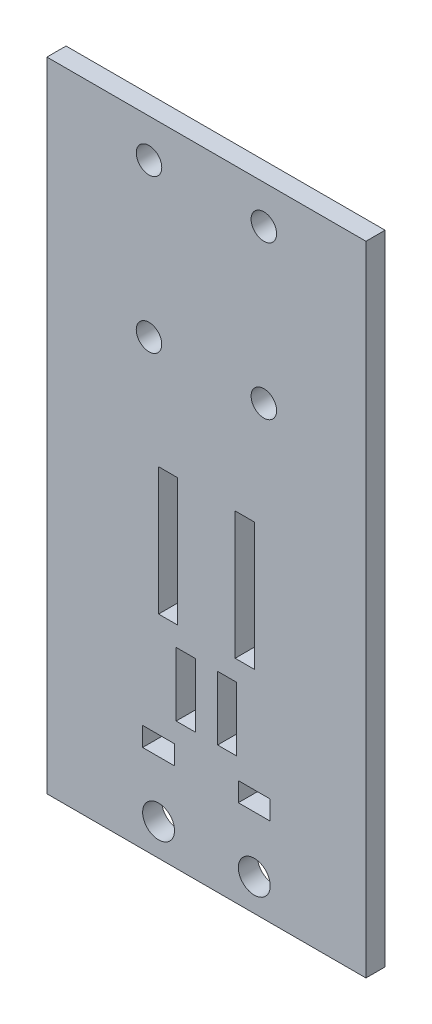
ISO-10303-21;
HEADER;
FILE_DESCRIPTION(('STEP AP214'),'2;1');
FILE_NAME('part.step','',(''),(''),'','','');
FILE_SCHEMA(('AUTOMOTIVE_DESIGN { 1 0 10303 214 1 1 1 1 }'));
ENDSEC;
DATA;
#1=APPLICATION_CONTEXT('core data for automotive mechanical design processes');
#2=APPLICATION_PROTOCOL_DEFINITION('international standard','automotive_design',2000,#1);
#3=PRODUCT_CONTEXT('',#1,'mechanical');
#4=PRODUCT('Part','Part','',(#3));
#5=PRODUCT_RELATED_PRODUCT_CATEGORY('part','',(#4));
#6=PRODUCT_DEFINITION_FORMATION('','',#4);
#7=PRODUCT_DEFINITION_CONTEXT('part definition',#1,'design');
#8=PRODUCT_DEFINITION('design','',#6,#7);
#9=PRODUCT_DEFINITION_SHAPE('','',#8);
#10=(LENGTH_UNIT() NAMED_UNIT(*) SI_UNIT(.MILLI.,.METRE.));
#11=(NAMED_UNIT(*) PLANE_ANGLE_UNIT() SI_UNIT($,.RADIAN.));
#12=(NAMED_UNIT(*) SI_UNIT($,.STERADIAN.) SOLID_ANGLE_UNIT());
#13=UNCERTAINTY_MEASURE_WITH_UNIT(LENGTH_MEASURE(1.E-05),#10,'distance_accuracy_value','');
#14=(GEOMETRIC_REPRESENTATION_CONTEXT(3) GLOBAL_UNCERTAINTY_ASSIGNED_CONTEXT((#13)) GLOBAL_UNIT_ASSIGNED_CONTEXT((#10,
#11,#12)) REPRESENTATION_CONTEXT('',''));
#15=CARTESIAN_POINT('',(0.,0.,0.));
#16=DIRECTION('',(0.,0.,1.));
#17=DIRECTION('',(1.,0.,0.));
#18=AXIS2_PLACEMENT_3D('',#15,#16,#17);
#19=CARTESIAN_POINT('',(0.,0.,3.));
#20=DIRECTION('',(0.,0.,1.));
#21=DIRECTION('',(1.,0.,0.));
#22=AXIS2_PLACEMENT_3D('',#19,#20,#21);
#23=PLANE('',#22);
#24=DIRECTION('',(0.,-1.,0.));
#25=VECTOR('',#24,1.);
#26=CARTESIAN_POINT('',(-9.99999999999999,-36.2096136594406,3.));
#27=LINE('',#26,#25);
#28=CARTESIAN_POINT('',(-9.99999999999999,-33.2096136594406,3.));
#29=VERTEX_POINT('',#28);
#30=CARTESIAN_POINT('',(-9.99999999999999,-36.2096136594406,3.));
#31=VERTEX_POINT('',#30);
#32=EDGE_CURVE('E55',#29,#31,#27,.T.);
#33=ORIENTED_EDGE('',*,*,#32,.F.);
#34=DIRECTION('',(-1.,0.,0.));
#35=VECTOR('',#34,1.);
#36=CARTESIAN_POINT('',(-4.99999999999999,-33.2096136594406,3.));
#37=LINE('',#36,#35);
#38=CARTESIAN_POINT('',(-4.99999999999999,-33.2096136594406,3.));
#39=VERTEX_POINT('',#38);
#40=EDGE_CURVE('E249',#39,#29,#37,.T.);
#41=ORIENTED_EDGE('',*,*,#40,.F.);
#42=DIRECTION('',(0.,1.,0.));
#43=VECTOR('',#42,1.);
#44=CARTESIAN_POINT('',(-4.99999999999999,-36.2096136594406,3.));
#45=LINE('',#44,#43);
#46=CARTESIAN_POINT('',(-4.99999999999999,-36.2096136594406,3.));
#47=VERTEX_POINT('',#46);
#48=EDGE_CURVE('E253',#47,#39,#45,.T.);
#49=ORIENTED_EDGE('',*,*,#48,.F.);
#50=DIRECTION('',(1.,0.,0.));
#51=VECTOR('',#50,1.);
#52=CARTESIAN_POINT('',(-4.99999999999999,-36.2096136594406,3.));
#53=LINE('',#52,#51);
#54=EDGE_CURVE('E262',#31,#47,#53,.T.);
#55=ORIENTED_EDGE('',*,*,#54,.F.);
#56=EDGE_LOOP('',(#33,#41,#49,#55));
#57=FACE_BOUND('',#56,.T.);
#58=DIRECTION('',(1.,0.,0.));
#59=VECTOR('',#58,1.);
#60=CARTESIAN_POINT('',(4.99999999999999,-36.2096136594406,3.));
#61=LINE('',#60,#59);
#62=CARTESIAN_POINT('',(4.99999999999999,-36.2096136594406,3.));
#63=VERTEX_POINT('',#62);
#64=CARTESIAN_POINT('',(9.99999999999999,-36.2096136594406,3.));
#65=VERTEX_POINT('',#64);
#66=EDGE_CURVE('E63',#63,#65,#61,.T.);
#67=ORIENTED_EDGE('',*,*,#66,.F.);
#68=DIRECTION('',(0.,-1.,0.));
#69=VECTOR('',#68,1.);
#70=CARTESIAN_POINT('',(4.99999999999999,-36.2096136594406,3.));
#71=LINE('',#70,#69);
#72=CARTESIAN_POINT('',(4.99999999999999,-33.2096136594406,3.));
#73=VERTEX_POINT('',#72);
#74=EDGE_CURVE('E283',#73,#63,#71,.T.);
#75=ORIENTED_EDGE('',*,*,#74,.F.);
#76=DIRECTION('',(-1.,0.,0.));
#77=VECTOR('',#76,1.);
#78=CARTESIAN_POINT('',(4.99999999999999,-33.2096136594406,3.));
#79=LINE('',#78,#77);
#80=CARTESIAN_POINT('',(9.99999999999999,-33.2096136594406,3.));
#81=VERTEX_POINT('',#80);
#82=EDGE_CURVE('E302',#81,#73,#79,.T.);
#83=ORIENTED_EDGE('',*,*,#82,.F.);
#84=DIRECTION('',(0.,1.,0.));
#85=VECTOR('',#84,1.);
#86=CARTESIAN_POINT('',(9.99999999999999,-36.2096136594406,3.));
#87=LINE('',#86,#85);
#88=EDGE_CURVE('E298',#65,#81,#87,.T.);
#89=ORIENTED_EDGE('',*,*,#88,.F.);
#90=EDGE_LOOP('',(#67,#75,#83,#89));
#91=FACE_BOUND('',#90,.T.);
#92=DIRECTION('',(0.,1.,0.));
#93=VECTOR('',#92,1.);
#94=CARTESIAN_POINT('',(-1.74999999999999,-20.,3.));
#95=LINE('',#94,#93);
#96=CARTESIAN_POINT('',(-1.74999999999999,-30.,3.));
#97=VERTEX_POINT('',#96);
#98=CARTESIAN_POINT('',(-1.74999999999999,-20.,3.));
#99=VERTEX_POINT('',#98);
#100=EDGE_CURVE('E319',#97,#99,#95,.T.);
#101=ORIENTED_EDGE('',*,*,#100,.F.);
#102=DIRECTION('',(1.,0.,0.));
#103=VECTOR('',#102,1.);
#104=CARTESIAN_POINT('',(-4.74999999999999,-30.,3.));
#105=LINE('',#104,#103);
#106=CARTESIAN_POINT('',(-4.74999999999999,-30.,3.));
#107=VERTEX_POINT('',#106);
#108=EDGE_CURVE('E331',#107,#97,#105,.T.);
#109=ORIENTED_EDGE('',*,*,#108,.F.);
#110=DIRECTION('',(0.,-1.,0.));
#111=VECTOR('',#110,1.);
#112=CARTESIAN_POINT('',(-4.74999999999999,-20.,3.));
#113=LINE('',#112,#111);
#114=CARTESIAN_POINT('',(-4.74999999999999,-20.,3.));
#115=VERTEX_POINT('',#114);
#116=EDGE_CURVE('E327',#115,#107,#113,.T.);
#117=ORIENTED_EDGE('',*,*,#116,.F.);
#118=DIRECTION('',(-1.,0.,0.));
#119=VECTOR('',#118,1.);
#120=CARTESIAN_POINT('',(-4.74999999999999,-20.,3.));
#121=LINE('',#120,#119);
#122=EDGE_CURVE('E322',#99,#115,#121,.T.);
#123=ORIENTED_EDGE('',*,*,#122,.F.);
#124=EDGE_LOOP('',(#101,#109,#117,#123));
#125=FACE_BOUND('',#124,.T.);
#126=DIRECTION('',(0.,1.,0.));
#127=VECTOR('',#126,1.);
#128=CARTESIAN_POINT('',(4.75000000000001,-20.,3.));
#129=LINE('',#128,#127);
#130=CARTESIAN_POINT('',(4.75000000000001,-30.,3.));
#131=VERTEX_POINT('',#130);
#132=CARTESIAN_POINT('',(4.75000000000001,-20.,3.));
#133=VERTEX_POINT('',#132);
#134=EDGE_CURVE('E272',#131,#133,#129,.T.);
#135=ORIENTED_EDGE('',*,*,#134,.F.);
#136=DIRECTION('',(1.,0.,0.));
#137=VECTOR('',#136,1.);
#138=CARTESIAN_POINT('',(4.75000000000001,-30.,3.));
#139=LINE('',#138,#137);
#140=CARTESIAN_POINT('',(1.75000000000001,-30.,3.));
#141=VERTEX_POINT('',#140);
#142=EDGE_CURVE('E359',#141,#131,#139,.T.);
#143=ORIENTED_EDGE('',*,*,#142,.F.);
#144=DIRECTION('',(0.,-1.,0.));
#145=VECTOR('',#144,1.);
#146=CARTESIAN_POINT('',(1.75000000000001,-20.,3.));
#147=LINE('',#146,#145);
#148=CARTESIAN_POINT('',(1.75000000000001,-20.,3.));
#149=VERTEX_POINT('',#148);
#150=EDGE_CURVE('E355',#149,#141,#147,.T.);
#151=ORIENTED_EDGE('',*,*,#150,.F.);
#152=DIRECTION('',(-1.,0.,0.));
#153=VECTOR('',#152,1.);
#154=CARTESIAN_POINT('',(4.75000000000001,-20.,3.));
#155=LINE('',#154,#153);
#156=EDGE_CURVE('E351',#133,#149,#155,.T.);
#157=ORIENTED_EDGE('',*,*,#156,.F.);
#158=EDGE_LOOP('',(#135,#143,#151,#157));
#159=FACE_BOUND('',#158,.T.);
#160=CARTESIAN_POINT('',(-7.5,-45.,3.));
#161=DIRECTION('',(0.,0.,1.));
#162=DIRECTION('',(1.,0.,0.));
#163=AXIS2_PLACEMENT_3D('',#160,#161,#162);
#164=CIRCLE('',#163,2.5);
#165=CARTESIAN_POINT('',(-5.,-45.,3.));
#166=VERTEX_POINT('',#165);
#167=EDGE_CURVE('E383',#166,#166,#164,.T.);
#168=ORIENTED_EDGE('',*,*,#167,.F.);
#169=EDGE_LOOP('',(#168));
#170=FACE_BOUND('',#169,.T.);
#171=CARTESIAN_POINT('',(-9.,20.,3.));
#172=DIRECTION('',(0.,0.,1.));
#173=DIRECTION('',(-1.,0.,0.));
#174=AXIS2_PLACEMENT_3D('',#171,#172,#173);
#175=CIRCLE('',#174,2.);
#176=CARTESIAN_POINT('',(-11.,20.,3.));
#177=VERTEX_POINT('',#176);
#178=EDGE_CURVE('E485',#177,#177,#175,.T.);
#179=ORIENTED_EDGE('',*,*,#178,.F.);
#180=EDGE_LOOP('',(#179));
#181=FACE_BOUND('',#180,.T.);
#182=CARTESIAN_POINT('',(-9.,44.,3.));
#183=DIRECTION('',(0.,0.,1.));
#184=DIRECTION('',(1.,0.,0.));
#185=AXIS2_PLACEMENT_3D('',#182,#183,#184);
#186=CIRCLE('',#185,2.);
#187=CARTESIAN_POINT('',(-7.,44.,3.));
#188=VERTEX_POINT('',#187);
#189=EDGE_CURVE('E501',#188,#188,#186,.T.);
#190=ORIENTED_EDGE('',*,*,#189,.F.);
#191=EDGE_LOOP('',(#190));
#192=FACE_BOUND('',#191,.T.);
#193=DIRECTION('',(0.,-1.,0.));
#194=VECTOR('',#193,1.);
#195=CARTESIAN_POINT('',(-25.,-50.,3.));
#196=LINE('',#195,#194);
#197=CARTESIAN_POINT('',(-25.,50.,3.));
#198=VERTEX_POINT('',#197);
#199=CARTESIAN_POINT('',(-25.,-50.,3.));
#200=VERTEX_POINT('',#199);
#201=EDGE_CURVE('E509',#198,#200,#196,.T.);
#202=ORIENTED_EDGE('',*,*,#201,.T.);
#203=DIRECTION('',(1.,0.,0.));
#204=VECTOR('',#203,1.);
#205=CARTESIAN_POINT('',(25.,-50.,3.));
#206=LINE('',#205,#204);
#207=CARTESIAN_POINT('',(25.,-50.,3.));
#208=VERTEX_POINT('',#207);
#209=EDGE_CURVE('E513',#200,#208,#206,.T.);
#210=ORIENTED_EDGE('',*,*,#209,.T.);
#211=DIRECTION('',(0.,1.,0.));
#212=VECTOR('',#211,1.);
#213=CARTESIAN_POINT('',(25.,-50.,3.));
#214=LINE('',#213,#212);
#215=CARTESIAN_POINT('',(25.,50.,3.));
#216=VERTEX_POINT('',#215);
#217=EDGE_CURVE('E517',#208,#216,#214,.T.);
#218=ORIENTED_EDGE('',*,*,#217,.T.);
#219=DIRECTION('',(-1.,0.,0.));
#220=VECTOR('',#219,1.);
#221=CARTESIAN_POINT('',(25.,50.,3.));
#222=LINE('',#221,#220);
#223=EDGE_CURVE('E520',#216,#198,#222,.T.);
#224=ORIENTED_EDGE('',*,*,#223,.T.);
#225=EDGE_LOOP('',(#202,#210,#218,#224));
#226=FACE_BOUND('',#225,.T.);
#227=CARTESIAN_POINT('',(9.,44.,3.));
#228=DIRECTION('',(0.,0.,1.));
#229=DIRECTION('',(-1.,0.,0.));
#230=AXIS2_PLACEMENT_3D('',#227,#228,#229);
#231=CIRCLE('',#230,2.);
#232=CARTESIAN_POINT('',(7.,44.,3.));
#233=VERTEX_POINT('',#232);
#234=EDGE_CURVE('E493',#233,#233,#231,.T.);
#235=ORIENTED_EDGE('',*,*,#234,.F.);
#236=EDGE_LOOP('',(#235));
#237=FACE_BOUND('',#236,.T.);
#238=CARTESIAN_POINT('',(9.,20.,3.));
#239=DIRECTION('',(0.,0.,1.));
#240=DIRECTION('',(1.,0.,0.));
#241=AXIS2_PLACEMENT_3D('',#238,#239,#240);
#242=CIRCLE('',#241,2.);
#243=CARTESIAN_POINT('',(11.,20.,3.));
#244=VERTEX_POINT('',#243);
#245=EDGE_CURVE('E477',#244,#244,#242,.T.);
#246=ORIENTED_EDGE('',*,*,#245,.F.);
#247=EDGE_LOOP('',(#246));
#248=FACE_BOUND('',#247,.T.);
#249=DIRECTION('',(1.,0.,0.));
#250=VECTOR('',#249,1.);
#251=CARTESIAN_POINT('',(4.5,-16.8517712337391,3.));
#252=LINE('',#251,#250);
#253=CARTESIAN_POINT('',(4.5,-16.8517712337391,3.));
#254=VERTEX_POINT('',#253);
#255=CARTESIAN_POINT('',(7.5,-16.8517712337391,3.));
#256=VERTEX_POINT('',#255);
#257=EDGE_CURVE('E437',#254,#256,#252,.T.);
#258=ORIENTED_EDGE('',*,*,#257,.F.);
#259=DIRECTION('',(0.,-1.,0.));
#260=VECTOR('',#259,1.);
#261=CARTESIAN_POINT('',(4.5,-16.8517712337391,3.));
#262=LINE('',#261,#260);
#263=CARTESIAN_POINT('',(4.5,3.14822876626087,3.));
#264=VERTEX_POINT('',#263);
#265=EDGE_CURVE('E434',#264,#254,#262,.T.);
#266=ORIENTED_EDGE('',*,*,#265,.F.);
#267=DIRECTION('',(-1.,0.,0.));
#268=VECTOR('',#267,1.);
#269=CARTESIAN_POINT('',(4.5,3.14822876626087,3.));
#270=LINE('',#269,#268);
#271=CARTESIAN_POINT('',(7.5,3.14822876626087,3.));
#272=VERTEX_POINT('',#271);
#273=EDGE_CURVE('E445',#272,#264,#270,.T.);
#274=ORIENTED_EDGE('',*,*,#273,.F.);
#275=DIRECTION('',(0.,1.,0.));
#276=VECTOR('',#275,1.);
#277=CARTESIAN_POINT('',(7.5,-16.8517712337391,3.));
#278=LINE('',#277,#276);
#279=EDGE_CURVE('E441',#256,#272,#278,.T.);
#280=ORIENTED_EDGE('',*,*,#279,.F.);
#281=EDGE_LOOP('',(#258,#266,#274,#280));
#282=FACE_BOUND('',#281,.T.);
#283=DIRECTION('',(1.,0.,0.));
#284=VECTOR('',#283,1.);
#285=CARTESIAN_POINT('',(-4.5,-16.8517712337391,3.));
#286=LINE('',#285,#284);
#287=CARTESIAN_POINT('',(-7.5,-16.8517712337391,3.));
#288=VERTEX_POINT('',#287);
#289=CARTESIAN_POINT('',(-4.5,-16.8517712337391,3.));
#290=VERTEX_POINT('',#289);
#291=EDGE_CURVE('E394',#288,#290,#286,.T.);
#292=ORIENTED_EDGE('',*,*,#291,.F.);
#293=DIRECTION('',(0.,-1.,0.));
#294=VECTOR('',#293,1.);
#295=CARTESIAN_POINT('',(-7.5,-16.8517712337391,3.));
#296=LINE('',#295,#294);
#297=CARTESIAN_POINT('',(-7.5,3.14822876626087,3.));
#298=VERTEX_POINT('',#297);
#299=EDGE_CURVE('E391',#298,#288,#296,.T.);
#300=ORIENTED_EDGE('',*,*,#299,.F.);
#301=DIRECTION('',(-1.,0.,0.));
#302=VECTOR('',#301,1.);
#303=CARTESIAN_POINT('',(-4.5,3.14822876626087,3.));
#304=LINE('',#303,#302);
#305=CARTESIAN_POINT('',(-4.5,3.14822876626087,3.));
#306=VERTEX_POINT('',#305);
#307=EDGE_CURVE('E402',#306,#298,#304,.T.);
#308=ORIENTED_EDGE('',*,*,#307,.F.);
#309=DIRECTION('',(0.,1.,0.));
#310=VECTOR('',#309,1.);
#311=CARTESIAN_POINT('',(-4.5,-16.8517712337391,3.));
#312=LINE('',#311,#310);
#313=EDGE_CURVE('E398',#290,#306,#312,.T.);
#314=ORIENTED_EDGE('',*,*,#313,.F.);
#315=EDGE_LOOP('',(#292,#300,#308,#314));
#316=FACE_BOUND('',#315,.T.);
#317=CARTESIAN_POINT('',(7.5,-45.,3.));
#318=DIRECTION('',(0.,0.,1.));
#319=DIRECTION('',(-1.,0.,0.));
#320=AXIS2_PLACEMENT_3D('',#317,#318,#319);
#321=CIRCLE('',#320,2.5);
#322=CARTESIAN_POINT('',(5.,-45.,3.));
#323=VERTEX_POINT('',#322);
#324=EDGE_CURVE('E375',#323,#323,#321,.T.);
#325=ORIENTED_EDGE('',*,*,#324,.F.);
#326=EDGE_LOOP('',(#325));
#327=FACE_BOUND('',#326,.T.);
#328=ADVANCED_FACE('F39',(#57,#91,#125,#159,#170,#181,#192,#226,#237,#248,#282,#316,#327),#23,.T.);
#329=CARTESIAN_POINT('',(0.,0.,0.));
#330=DIRECTION('',(0.,0.,1.));
#331=DIRECTION('',(1.,0.,0.));
#332=AXIS2_PLACEMENT_3D('',#329,#330,#331);
#333=PLANE('',#332);
#334=DIRECTION('',(-1.,0.,0.));
#335=VECTOR('',#334,1.);
#336=CARTESIAN_POINT('',(-4.99999999999999,-33.2096136594406,0.));
#337=LINE('',#336,#335);
#338=CARTESIAN_POINT('',(-4.99999999999999,-33.2096136594406,0.));
#339=VERTEX_POINT('',#338);
#340=CARTESIAN_POINT('',(-9.99999999999999,-33.2096136594406,0.));
#341=VERTEX_POINT('',#340);
#342=EDGE_CURVE('E234',#339,#341,#337,.T.);
#343=ORIENTED_EDGE('',*,*,#342,.T.);
#344=DIRECTION('',(0.,-1.,0.));
#345=VECTOR('',#344,1.);
#346=CARTESIAN_POINT('',(-9.99999999999999,-36.2096136594406,0.));
#347=LINE('',#346,#345);
#348=CARTESIAN_POINT('',(-9.99999999999999,-36.2096136594406,0.));
#349=VERTEX_POINT('',#348);
#350=EDGE_CURVE('E227',#341,#349,#347,.T.);
#351=ORIENTED_EDGE('',*,*,#350,.T.);
#352=DIRECTION('',(1.,0.,0.));
#353=VECTOR('',#352,1.);
#354=CARTESIAN_POINT('',(-4.99999999999999,-36.2096136594406,0.));
#355=LINE('',#354,#353);
#356=CARTESIAN_POINT('',(-4.99999999999999,-36.2096136594406,0.));
#357=VERTEX_POINT('',#356);
#358=EDGE_CURVE('E238',#349,#357,#355,.T.);
#359=ORIENTED_EDGE('',*,*,#358,.T.);
#360=DIRECTION('',(0.,1.,0.));
#361=VECTOR('',#360,1.);
#362=CARTESIAN_POINT('',(-4.99999999999999,-36.2096136594406,0.));
#363=LINE('',#362,#361);
#364=EDGE_CURVE('E243',#357,#339,#363,.T.);
#365=ORIENTED_EDGE('',*,*,#364,.T.);
#366=EDGE_LOOP('',(#343,#351,#359,#365));
#367=FACE_BOUND('',#366,.T.);
#368=DIRECTION('',(0.,-1.,0.));
#369=VECTOR('',#368,1.);
#370=CARTESIAN_POINT('',(4.99999999999999,-36.2096136594406,0.));
#371=LINE('',#370,#369);
#372=CARTESIAN_POINT('',(4.99999999999999,-33.2096136594406,0.));
#373=VERTEX_POINT('',#372);
#374=CARTESIAN_POINT('',(4.99999999999999,-36.2096136594406,0.));
#375=VERTEX_POINT('',#374);
#376=EDGE_CURVE('E291',#373,#375,#371,.T.);
#377=ORIENTED_EDGE('',*,*,#376,.T.);
#378=DIRECTION('',(1.,0.,0.));
#379=VECTOR('',#378,1.);
#380=CARTESIAN_POINT('',(4.99999999999999,-36.2096136594406,0.));
#381=LINE('',#380,#379);
#382=CARTESIAN_POINT('',(9.99999999999999,-36.2096136594406,0.));
#383=VERTEX_POINT('',#382);
#384=EDGE_CURVE('E278',#375,#383,#381,.T.);
#385=ORIENTED_EDGE('',*,*,#384,.T.);
#386=DIRECTION('',(0.,1.,0.));
#387=VECTOR('',#386,1.);
#388=CARTESIAN_POINT('',(9.99999999999999,-36.2096136594406,0.));
#389=LINE('',#388,#387);
#390=CARTESIAN_POINT('',(9.99999999999999,-33.2096136594406,0.));
#391=VERTEX_POINT('',#390);
#392=EDGE_CURVE('E282',#383,#391,#389,.T.);
#393=ORIENTED_EDGE('',*,*,#392,.T.);
#394=DIRECTION('',(-1.,0.,0.));
#395=VECTOR('',#394,1.);
#396=CARTESIAN_POINT('',(4.99999999999999,-33.2096136594406,0.));
#397=LINE('',#396,#395);
#398=EDGE_CURVE('E287',#391,#373,#397,.T.);
#399=ORIENTED_EDGE('',*,*,#398,.T.);
#400=EDGE_LOOP('',(#377,#385,#393,#399));
#401=FACE_BOUND('',#400,.T.);
#402=DIRECTION('',(1.,0.,0.));
#403=VECTOR('',#402,1.);
#404=CARTESIAN_POINT('',(0.,-30.,0.));
#405=LINE('',#404,#403);
#406=CARTESIAN_POINT('',(-4.74999999999999,-30.,0.));
#407=VERTEX_POINT('',#406);
#408=CARTESIAN_POINT('',(-1.74999999999999,-30.,0.));
#409=VERTEX_POINT('',#408);
#410=EDGE_CURVE('E48',#407,#409,#405,.T.);
#411=ORIENTED_EDGE('',*,*,#410,.T.);
#412=DIRECTION('',(0.,1.,0.));
#413=VECTOR('',#412,1.);
#414=CARTESIAN_POINT('',(-1.75,0.,0.));
#415=LINE('',#414,#413);
#416=CARTESIAN_POINT('',(-1.74999999999999,-20.,0.));
#417=VERTEX_POINT('',#416);
#418=EDGE_CURVE('E11',#409,#417,#415,.T.);
#419=ORIENTED_EDGE('',*,*,#418,.T.);
#420=DIRECTION('',(-1.,0.,0.));
#421=VECTOR('',#420,1.);
#422=CARTESIAN_POINT('',(0.,-20.,0.));
#423=LINE('',#422,#421);
#424=CARTESIAN_POINT('',(-4.74999999999999,-20.,0.));
#425=VERTEX_POINT('',#424);
#426=EDGE_CURVE('E566',#417,#425,#423,.T.);
#427=ORIENTED_EDGE('',*,*,#426,.T.);
#428=DIRECTION('',(0.,-1.,0.));
#429=VECTOR('',#428,1.);
#430=CARTESIAN_POINT('',(-4.74999999999999,0.,0.));
#431=LINE('',#430,#429);
#432=EDGE_CURVE('E570',#425,#407,#431,.T.);
#433=ORIENTED_EDGE('',*,*,#432,.T.);
#434=EDGE_LOOP('',(#411,#419,#427,#433));
#435=FACE_BOUND('',#434,.T.);
#436=DIRECTION('',(1.,0.,0.));
#437=VECTOR('',#436,1.);
#438=CARTESIAN_POINT('',(0.,-30.,0.));
#439=LINE('',#438,#437);
#440=CARTESIAN_POINT('',(1.75000000000001,-30.,0.));
#441=VERTEX_POINT('',#440);
#442=CARTESIAN_POINT('',(4.75000000000001,-30.,0.));
#443=VERTEX_POINT('',#442);
#444=EDGE_CURVE('E558',#441,#443,#439,.T.);
#445=ORIENTED_EDGE('',*,*,#444,.T.);
#446=DIRECTION('',(0.,1.,0.));
#447=VECTOR('',#446,1.);
#448=CARTESIAN_POINT('',(4.75,0.,0.));
#449=LINE('',#448,#447);
#450=CARTESIAN_POINT('',(4.75000000000001,-20.,0.));
#451=VERTEX_POINT('',#450);
#452=EDGE_CURVE('E562',#443,#451,#449,.T.);
#453=ORIENTED_EDGE('',*,*,#452,.T.);
#454=DIRECTION('',(-1.,0.,0.));
#455=VECTOR('',#454,1.);
#456=CARTESIAN_POINT('',(0.,-20.,0.));
#457=LINE('',#456,#455);
#458=CARTESIAN_POINT('',(1.75000000000001,-20.,0.));
#459=VERTEX_POINT('',#458);
#460=EDGE_CURVE('E550',#451,#459,#457,.T.);
#461=ORIENTED_EDGE('',*,*,#460,.T.);
#462=DIRECTION('',(0.,-1.,0.));
#463=VECTOR('',#462,1.);
#464=CARTESIAN_POINT('',(1.75000000000001,0.,0.));
#465=LINE('',#464,#463);
#466=EDGE_CURVE('E554',#459,#441,#465,.T.);
#467=ORIENTED_EDGE('',*,*,#466,.T.);
#468=EDGE_LOOP('',(#445,#453,#461,#467));
#469=FACE_BOUND('',#468,.T.);
#470=DIRECTION('',(0.,-1.,0.));
#471=VECTOR('',#470,1.);
#472=CARTESIAN_POINT('',(4.5,-16.8517712337391,0.));
#473=LINE('',#472,#471);
#474=CARTESIAN_POINT('',(4.5,3.14822876626087,0.));
#475=VERTEX_POINT('',#474);
#476=CARTESIAN_POINT('',(4.5,-16.8517712337391,0.));
#477=VERTEX_POINT('',#476);
#478=EDGE_CURVE('E433',#475,#477,#473,.T.);
#479=ORIENTED_EDGE('',*,*,#478,.T.);
#480=DIRECTION('',(1.,0.,0.));
#481=VECTOR('',#480,1.);
#482=CARTESIAN_POINT('',(4.5,-16.8517712337391,0.));
#483=LINE('',#482,#481);
#484=CARTESIAN_POINT('',(7.5,-16.8517712337391,0.));
#485=VERTEX_POINT('',#484);
#486=EDGE_CURVE('E452',#477,#485,#483,.T.);
#487=ORIENTED_EDGE('',*,*,#486,.T.);
#488=DIRECTION('',(0.,1.,0.));
#489=VECTOR('',#488,1.);
#490=CARTESIAN_POINT('',(7.5,-16.8517712337391,0.));
#491=LINE('',#490,#489);
#492=CARTESIAN_POINT('',(7.5,3.14822876626087,0.));
#493=VERTEX_POINT('',#492);
#494=EDGE_CURVE('E456',#485,#493,#491,.T.);
#495=ORIENTED_EDGE('',*,*,#494,.T.);
#496=DIRECTION('',(-1.,0.,0.));
#497=VECTOR('',#496,1.);
#498=CARTESIAN_POINT('',(4.5,3.14822876626087,0.));
#499=LINE('',#498,#497);
#500=EDGE_CURVE('E438',#493,#475,#499,.T.);
#501=ORIENTED_EDGE('',*,*,#500,.T.);
#502=EDGE_LOOP('',(#479,#487,#495,#501));
#503=FACE_BOUND('',#502,.T.);
#504=DIRECTION('',(0.,-1.,0.));
#505=VECTOR('',#504,1.);
#506=CARTESIAN_POINT('',(-25.,-50.,0.));
#507=LINE('',#506,#505);
#508=CARTESIAN_POINT('',(-25.,50.,0.));
#509=VERTEX_POINT('',#508);
#510=CARTESIAN_POINT('',(-25.,-50.,0.));
#511=VERTEX_POINT('',#510);
#512=EDGE_CURVE('E505',#509,#511,#507,.T.);
#513=ORIENTED_EDGE('',*,*,#512,.F.);
#514=DIRECTION('',(-1.,0.,0.));
#515=VECTOR('',#514,1.);
#516=CARTESIAN_POINT('',(25.,50.,0.));
#517=LINE('',#516,#515);
#518=CARTESIAN_POINT('',(25.,50.,0.));
#519=VERTEX_POINT('',#518);
#520=EDGE_CURVE('E514',#519,#509,#517,.T.);
#521=ORIENTED_EDGE('',*,*,#520,.F.);
#522=DIRECTION('',(0.,1.,0.));
#523=VECTOR('',#522,1.);
#524=CARTESIAN_POINT('',(25.,-50.,0.));
#525=LINE('',#524,#523);
#526=CARTESIAN_POINT('',(25.,-50.,0.));
#527=VERTEX_POINT('',#526);
#528=EDGE_CURVE('E530',#527,#519,#525,.T.);
#529=ORIENTED_EDGE('',*,*,#528,.F.);
#530=DIRECTION('',(1.,0.,0.));
#531=VECTOR('',#530,1.);
#532=CARTESIAN_POINT('',(25.,-50.,0.));
#533=LINE('',#532,#531);
#534=EDGE_CURVE('E527',#511,#527,#533,.T.);
#535=ORIENTED_EDGE('',*,*,#534,.F.);
#536=EDGE_LOOP('',(#513,#521,#529,#535));
#537=FACE_BOUND('',#536,.T.);
#538=CARTESIAN_POINT('',(-9.,44.,0.));
#539=DIRECTION('',(0.,0.,1.));
#540=DIRECTION('',(1.,0.,0.));
#541=AXIS2_PLACEMENT_3D('',#538,#539,#540);
#542=CIRCLE('',#541,2.);
#543=CARTESIAN_POINT('',(-7.,44.,0.));
#544=VERTEX_POINT('',#543);
#545=EDGE_CURVE('E497',#544,#544,#542,.T.);
#546=ORIENTED_EDGE('',*,*,#545,.T.);
#547=EDGE_LOOP('',(#546));
#548=FACE_BOUND('',#547,.T.);
#549=CARTESIAN_POINT('',(9.,44.,0.));
#550=DIRECTION('',(0.,0.,1.));
#551=DIRECTION('',(-1.,0.,0.));
#552=AXIS2_PLACEMENT_3D('',#549,#550,#551);
#553=CIRCLE('',#552,2.);
#554=CARTESIAN_POINT('',(7.,44.,0.));
#555=VERTEX_POINT('',#554);
#556=EDGE_CURVE('E489',#555,#555,#553,.T.);
#557=ORIENTED_EDGE('',*,*,#556,.T.);
#558=EDGE_LOOP('',(#557));
#559=FACE_BOUND('',#558,.T.);
#560=CARTESIAN_POINT('',(-9.,20.,0.));
#561=DIRECTION('',(0.,0.,1.));
#562=DIRECTION('',(-1.,0.,0.));
#563=AXIS2_PLACEMENT_3D('',#560,#561,#562);
#564=CIRCLE('',#563,2.);
#565=CARTESIAN_POINT('',(-11.,20.,0.));
#566=VERTEX_POINT('',#565);
#567=EDGE_CURVE('E481',#566,#566,#564,.T.);
#568=ORIENTED_EDGE('',*,*,#567,.T.);
#569=EDGE_LOOP('',(#568));
#570=FACE_BOUND('',#569,.T.);
#571=CARTESIAN_POINT('',(9.,20.,0.));
#572=DIRECTION('',(0.,0.,1.));
#573=DIRECTION('',(1.,0.,0.));
#574=AXIS2_PLACEMENT_3D('',#571,#572,#573);
#575=CIRCLE('',#574,2.);
#576=CARTESIAN_POINT('',(11.,20.,0.));
#577=VERTEX_POINT('',#576);
#578=EDGE_CURVE('E476',#577,#577,#575,.T.);
#579=ORIENTED_EDGE('',*,*,#578,.T.);
#580=EDGE_LOOP('',(#579));
#581=FACE_BOUND('',#580,.T.);
#582=DIRECTION('',(0.,-1.,0.));
#583=VECTOR('',#582,1.);
#584=CARTESIAN_POINT('',(-7.5,-16.8517712337391,0.));
#585=LINE('',#584,#583);
#586=CARTESIAN_POINT('',(-7.5,3.14822876626087,0.));
#587=VERTEX_POINT('',#586);
#588=CARTESIAN_POINT('',(-7.5,-16.8517712337391,0.));
#589=VERTEX_POINT('',#588);
#590=EDGE_CURVE('E387',#587,#589,#585,.T.);
#591=ORIENTED_EDGE('',*,*,#590,.T.);
#592=DIRECTION('',(1.,0.,0.));
#593=VECTOR('',#592,1.);
#594=CARTESIAN_POINT('',(-4.5,-16.8517712337391,0.));
#595=LINE('',#594,#593);
#596=CARTESIAN_POINT('',(-4.5,-16.8517712337391,0.));
#597=VERTEX_POINT('',#596);
#598=EDGE_CURVE('E409',#589,#597,#595,.T.);
#599=ORIENTED_EDGE('',*,*,#598,.T.);
#600=DIRECTION('',(0.,1.,0.));
#601=VECTOR('',#600,1.);
#602=CARTESIAN_POINT('',(-4.5,-16.8517712337391,0.));
#603=LINE('',#602,#601);
#604=CARTESIAN_POINT('',(-4.5,3.14822876626087,0.));
#605=VERTEX_POINT('',#604);
#606=EDGE_CURVE('E413',#597,#605,#603,.T.);
#607=ORIENTED_EDGE('',*,*,#606,.T.);
#608=DIRECTION('',(-1.,0.,0.));
#609=VECTOR('',#608,1.);
#610=CARTESIAN_POINT('',(-4.5,3.14822876626087,0.));
#611=LINE('',#610,#609);
#612=EDGE_CURVE('E395',#605,#587,#611,.T.);
#613=ORIENTED_EDGE('',*,*,#612,.T.);
#614=EDGE_LOOP('',(#591,#599,#607,#613));
#615=FACE_BOUND('',#614,.T.);
#616=CARTESIAN_POINT('',(-7.5,-45.,0.));
#617=DIRECTION('',(0.,0.,1.));
#618=DIRECTION('',(1.,0.,0.));
#619=AXIS2_PLACEMENT_3D('',#616,#617,#618);
#620=CIRCLE('',#619,2.5);
#621=CARTESIAN_POINT('',(-5.,-45.,0.));
#622=VERTEX_POINT('',#621);
#623=EDGE_CURVE('E379',#622,#622,#620,.T.);
#624=ORIENTED_EDGE('',*,*,#623,.T.);
#625=EDGE_LOOP('',(#624));
#626=FACE_BOUND('',#625,.T.);
#627=CARTESIAN_POINT('',(7.5,-45.,0.));
#628=DIRECTION('',(0.,0.,1.));
#629=DIRECTION('',(-1.,0.,0.));
#630=AXIS2_PLACEMENT_3D('',#627,#628,#629);
#631=CIRCLE('',#630,2.5);
#632=CARTESIAN_POINT('',(5.,-45.,0.));
#633=VERTEX_POINT('',#632);
#634=EDGE_CURVE('E339',#633,#633,#631,.T.);
#635=ORIENTED_EDGE('',*,*,#634,.T.);
#636=EDGE_LOOP('',(#635));
#637=FACE_BOUND('',#636,.T.);
#638=ADVANCED_FACE('F245',(#367,#401,#435,#469,#503,#537,#548,#559,#570,#581,#615,#626,#637),
#333,.F.);
#639=CARTESIAN_POINT('',(-25.,-50.,3.));
#640=DIRECTION('',(1.,0.,0.));
#641=DIRECTION('',(0.,0.,-1.));
#642=AXIS2_PLACEMENT_3D('',#639,#640,#641);
#643=PLANE('',#642);
#644=ORIENTED_EDGE('',*,*,#512,.T.);
#645=DIRECTION('',(0.,0.,-1.));
#646=VECTOR('',#645,1.);
#647=CARTESIAN_POINT('',(-25.,-50.,3.));
#648=LINE('',#647,#646);
#649=EDGE_CURVE('E546',#200,#511,#648,.T.);
#650=ORIENTED_EDGE('',*,*,#649,.F.);
#651=ORIENTED_EDGE('',*,*,#201,.F.);
#652=DIRECTION('',(0.,0.,-1.));
#653=VECTOR('',#652,1.);
#654=CARTESIAN_POINT('',(-25.,50.,3.));
#655=LINE('',#654,#653);
#656=EDGE_CURVE('E523',#198,#509,#655,.T.);
#657=ORIENTED_EDGE('',*,*,#656,.T.);
#658=EDGE_LOOP('',(#644,#650,#651,#657));
#659=FACE_BOUND('',#658,.T.);
#660=ADVANCED_FACE('F41',(#659),#643,.F.);
#661=CARTESIAN_POINT('',(25.,-50.,3.));
#662=DIRECTION('',(0.,1.,0.));
#663=DIRECTION('',(0.,0.,1.));
#664=AXIS2_PLACEMENT_3D('',#661,#662,#663);
#665=PLANE('',#664);
#666=ORIENTED_EDGE('',*,*,#534,.T.);
#667=DIRECTION('',(0.,0.,-1.));
#668=VECTOR('',#667,1.);
#669=CARTESIAN_POINT('',(25.,-50.,3.));
#670=LINE('',#669,#668);
#671=EDGE_CURVE('E542',#208,#527,#670,.T.);
#672=ORIENTED_EDGE('',*,*,#671,.F.);
#673=ORIENTED_EDGE('',*,*,#209,.F.);
#674=ORIENTED_EDGE('',*,*,#649,.T.);
#675=EDGE_LOOP('',(#666,#672,#673,#674));
#676=FACE_BOUND('',#675,.T.);
#677=ADVANCED_FACE('F624',(#676),#665,.F.);
#678=CARTESIAN_POINT('',(25.,-50.,3.));
#679=DIRECTION('',(-1.,0.,0.));
#680=DIRECTION('',(0.,0.,1.));
#681=AXIS2_PLACEMENT_3D('',#678,#679,#680);
#682=PLANE('',#681);
#683=ORIENTED_EDGE('',*,*,#528,.T.);
#684=DIRECTION('',(0.,0.,-1.));
#685=VECTOR('',#684,1.);
#686=CARTESIAN_POINT('',(25.,50.,3.));
#687=LINE('',#686,#685);
#688=EDGE_CURVE('E538',#216,#519,#687,.T.);
#689=ORIENTED_EDGE('',*,*,#688,.F.);
#690=ORIENTED_EDGE('',*,*,#217,.F.);
#691=ORIENTED_EDGE('',*,*,#671,.T.);
#692=EDGE_LOOP('',(#683,#689,#690,#691));
#693=FACE_BOUND('',#692,.T.);
#694=ADVANCED_FACE('F621',(#693),#682,.F.);
#695=CARTESIAN_POINT('',(25.,50.,3.));
#696=DIRECTION('',(0.,-1.,0.));
#697=DIRECTION('',(0.,0.,-1.));
#698=AXIS2_PLACEMENT_3D('',#695,#696,#697);
#699=PLANE('',#698);
#700=ORIENTED_EDGE('',*,*,#520,.T.);
#701=ORIENTED_EDGE('',*,*,#656,.F.);
#702=ORIENTED_EDGE('',*,*,#223,.F.);
#703=ORIENTED_EDGE('',*,*,#688,.T.);
#704=EDGE_LOOP('',(#700,#701,#702,#703));
#705=FACE_BOUND('',#704,.T.);
#706=ADVANCED_FACE('F618',(#705),#699,.F.);
#707=CARTESIAN_POINT('',(-9.,44.,3.));
#708=DIRECTION('',(0.,0.,-1.));
#709=DIRECTION('',(-1.,0.,0.));
#710=AXIS2_PLACEMENT_3D('',#707,#708,#709);
#711=CYLINDRICAL_SURFACE('',#710,2.);
#712=ORIENTED_EDGE('',*,*,#189,.T.);
#713=EDGE_LOOP('',(#712));
#714=FACE_BOUND('',#713,.T.);
#715=ORIENTED_EDGE('',*,*,#545,.F.);
#716=EDGE_LOOP('',(#715));
#717=FACE_BOUND('',#716,.T.);
#718=ADVANCED_FACE('F615',(#714,#717),#711,.F.);
#719=CARTESIAN_POINT('',(9.,44.,3.));
#720=DIRECTION('',(0.,0.,-1.));
#721=DIRECTION('',(-1.,0.,0.));
#722=AXIS2_PLACEMENT_3D('',#719,#720,#721);
#723=CYLINDRICAL_SURFACE('',#722,2.);
#724=ORIENTED_EDGE('',*,*,#234,.T.);
#725=EDGE_LOOP('',(#724));
#726=FACE_BOUND('',#725,.T.);
#727=ORIENTED_EDGE('',*,*,#556,.F.);
#728=EDGE_LOOP('',(#727));
#729=FACE_BOUND('',#728,.T.);
#730=ADVANCED_FACE('F717',(#726,#729),#723,.F.);
#731=CARTESIAN_POINT('',(-9.,20.,3.));
#732=DIRECTION('',(0.,0.,-1.));
#733=DIRECTION('',(-1.,0.,0.));
#734=AXIS2_PLACEMENT_3D('',#731,#732,#733);
#735=CYLINDRICAL_SURFACE('',#734,2.);
#736=ORIENTED_EDGE('',*,*,#178,.T.);
#737=EDGE_LOOP('',(#736));
#738=FACE_BOUND('',#737,.T.);
#739=ORIENTED_EDGE('',*,*,#567,.F.);
#740=EDGE_LOOP('',(#739));
#741=FACE_BOUND('',#740,.T.);
#742=ADVANCED_FACE('F714',(#738,#741),#735,.F.);
#743=CARTESIAN_POINT('',(9.,20.,3.));
#744=DIRECTION('',(0.,0.,-1.));
#745=DIRECTION('',(-1.,0.,0.));
#746=AXIS2_PLACEMENT_3D('',#743,#744,#745);
#747=CYLINDRICAL_SURFACE('',#746,2.);
#748=ORIENTED_EDGE('',*,*,#245,.T.);
#749=EDGE_LOOP('',(#748));
#750=FACE_BOUND('',#749,.T.);
#751=ORIENTED_EDGE('',*,*,#578,.F.);
#752=EDGE_LOOP('',(#751));
#753=FACE_BOUND('',#752,.T.);
#754=ADVANCED_FACE('F710',(#750,#753),#747,.F.);
#755=CARTESIAN_POINT('',(4.5,-16.8517712337391,3.));
#756=DIRECTION('',(1.,0.,0.));
#757=DIRECTION('',(0.,0.,-1.));
#758=AXIS2_PLACEMENT_3D('',#755,#756,#757);
#759=PLANE('',#758);
#760=ORIENTED_EDGE('',*,*,#478,.F.);
#761=DIRECTION('',(0.,0.,-1.));
#762=VECTOR('',#761,1.);
#763=CARTESIAN_POINT('',(4.5,3.14822876626087,3.));
#764=LINE('',#763,#762);
#765=EDGE_CURVE('E448',#264,#475,#764,.T.);
#766=ORIENTED_EDGE('',*,*,#765,.F.);
#767=ORIENTED_EDGE('',*,*,#265,.T.);
#768=DIRECTION('',(0.,0.,-1.));
#769=VECTOR('',#768,1.);
#770=CARTESIAN_POINT('',(4.5,-16.8517712337391,3.));
#771=LINE('',#770,#769);
#772=EDGE_CURVE('E472',#254,#477,#771,.T.);
#773=ORIENTED_EDGE('',*,*,#772,.T.);
#774=EDGE_LOOP('',(#760,#766,#767,#773));
#775=FACE_BOUND('',#774,.T.);
#776=ADVANCED_FACE('F706',(#775),#759,.T.);
#777=CARTESIAN_POINT('',(4.5,-16.8517712337391,3.));
#778=DIRECTION('',(0.,1.,0.));
#779=DIRECTION('',(0.,0.,1.));
#780=AXIS2_PLACEMENT_3D('',#777,#778,#779);
#781=PLANE('',#780);
#782=ORIENTED_EDGE('',*,*,#486,.F.);
#783=ORIENTED_EDGE('',*,*,#772,.F.);
#784=ORIENTED_EDGE('',*,*,#257,.T.);
#785=DIRECTION('',(0.,0.,-1.));
#786=VECTOR('',#785,1.);
#787=CARTESIAN_POINT('',(7.5,-16.8517712337391,3.));
#788=LINE('',#787,#786);
#789=EDGE_CURVE('E469',#256,#485,#788,.T.);
#790=ORIENTED_EDGE('',*,*,#789,.T.);
#791=EDGE_LOOP('',(#782,#783,#784,#790));
#792=FACE_BOUND('',#791,.T.);
#793=ADVANCED_FACE('F702',(#792),#781,.T.);
#794=CARTESIAN_POINT('',(7.5,-16.8517712337391,3.));
#795=DIRECTION('',(-1.,0.,0.));
#796=DIRECTION('',(0.,-1.,0.));
#797=AXIS2_PLACEMENT_3D('',#794,#795,#796);
#798=PLANE('',#797);
#799=ORIENTED_EDGE('',*,*,#494,.F.);
#800=ORIENTED_EDGE('',*,*,#789,.F.);
#801=ORIENTED_EDGE('',*,*,#279,.T.);
#802=DIRECTION('',(0.,0.,-1.));
#803=VECTOR('',#802,1.);
#804=CARTESIAN_POINT('',(7.5,3.14822876626087,3.));
#805=LINE('',#804,#803);
#806=EDGE_CURVE('E466',#272,#493,#805,.T.);
#807=ORIENTED_EDGE('',*,*,#806,.T.);
#808=EDGE_LOOP('',(#799,#800,#801,#807));
#809=FACE_BOUND('',#808,.T.);
#810=ADVANCED_FACE('F698',(#809),#798,.T.);
#811=CARTESIAN_POINT('',(4.5,3.14822876626087,3.));
#812=DIRECTION('',(0.,-1.,0.));
#813=DIRECTION('',(1.,0.,0.));
#814=AXIS2_PLACEMENT_3D('',#811,#812,#813);
#815=PLANE('',#814);
#816=ORIENTED_EDGE('',*,*,#500,.F.);
#817=ORIENTED_EDGE('',*,*,#806,.F.);
#818=ORIENTED_EDGE('',*,*,#273,.T.);
#819=ORIENTED_EDGE('',*,*,#765,.T.);
#820=EDGE_LOOP('',(#816,#817,#818,#819));
#821=FACE_BOUND('',#820,.T.);
#822=ADVANCED_FACE('F694',(#821),#815,.T.);
#823=CARTESIAN_POINT('',(-7.5,-16.8517712337391,3.));
#824=DIRECTION('',(1.,0.,0.));
#825=DIRECTION('',(0.,1.,0.));
#826=AXIS2_PLACEMENT_3D('',#823,#824,#825);
#827=PLANE('',#826);
#828=ORIENTED_EDGE('',*,*,#590,.F.);
#829=DIRECTION('',(0.,0.,-1.));
#830=VECTOR('',#829,1.);
#831=CARTESIAN_POINT('',(-7.5,3.14822876626087,3.));
#832=LINE('',#831,#830);
#833=EDGE_CURVE('E405',#298,#587,#832,.T.);
#834=ORIENTED_EDGE('',*,*,#833,.F.);
#835=ORIENTED_EDGE('',*,*,#299,.T.);
#836=DIRECTION('',(0.,0.,-1.));
#837=VECTOR('',#836,1.);
#838=CARTESIAN_POINT('',(-7.5,-16.8517712337391,3.));
#839=LINE('',#838,#837);
#840=EDGE_CURVE('E429',#288,#589,#839,.T.);
#841=ORIENTED_EDGE('',*,*,#840,.T.);
#842=EDGE_LOOP('',(#828,#834,#835,#841));
#843=FACE_BOUND('',#842,.T.);
#844=ADVANCED_FACE('F690',(#843),#827,.T.);
#845=CARTESIAN_POINT('',(-4.5,-16.8517712337391,3.));
#846=DIRECTION('',(0.,1.,0.));
#847=DIRECTION('',(0.,0.,1.));
#848=AXIS2_PLACEMENT_3D('',#845,#846,#847);
#849=PLANE('',#848);
#850=ORIENTED_EDGE('',*,*,#598,.F.);
#851=ORIENTED_EDGE('',*,*,#840,.F.);
#852=ORIENTED_EDGE('',*,*,#291,.T.);
#853=DIRECTION('',(0.,0.,-1.));
#854=VECTOR('',#853,1.);
#855=CARTESIAN_POINT('',(-4.5,-16.8517712337391,3.));
#856=LINE('',#855,#854);
#857=EDGE_CURVE('E426',#290,#597,#856,.T.);
#858=ORIENTED_EDGE('',*,*,#857,.T.);
#859=EDGE_LOOP('',(#850,#851,#852,#858));
#860=FACE_BOUND('',#859,.T.);
#861=ADVANCED_FACE('F686',(#860),#849,.T.);
#862=CARTESIAN_POINT('',(-4.5,-16.8517712337391,3.));
#863=DIRECTION('',(-1.,0.,0.));
#864=DIRECTION('',(0.,0.,1.));
#865=AXIS2_PLACEMENT_3D('',#862,#863,#864);
#866=PLANE('',#865);
#867=ORIENTED_EDGE('',*,*,#606,.F.);
#868=ORIENTED_EDGE('',*,*,#857,.F.);
#869=ORIENTED_EDGE('',*,*,#313,.T.);
#870=DIRECTION('',(0.,0.,-1.));
#871=VECTOR('',#870,1.);
#872=CARTESIAN_POINT('',(-4.5,3.14822876626087,3.));
#873=LINE('',#872,#871);
#874=EDGE_CURVE('E423',#306,#605,#873,.T.);
#875=ORIENTED_EDGE('',*,*,#874,.T.);
#876=EDGE_LOOP('',(#867,#868,#869,#875));
#877=FACE_BOUND('',#876,.T.);
#878=ADVANCED_FACE('F682',(#877),#866,.T.);
#879=CARTESIAN_POINT('',(-4.5,3.14822876626087,3.));
#880=DIRECTION('',(0.,-1.,0.));
#881=DIRECTION('',(1.,0.,0.));
#882=AXIS2_PLACEMENT_3D('',#879,#880,#881);
#883=PLANE('',#882);
#884=ORIENTED_EDGE('',*,*,#612,.F.);
#885=ORIENTED_EDGE('',*,*,#874,.F.);
#886=ORIENTED_EDGE('',*,*,#307,.T.);
#887=ORIENTED_EDGE('',*,*,#833,.T.);
#888=EDGE_LOOP('',(#884,#885,#886,#887));
#889=FACE_BOUND('',#888,.T.);
#890=ADVANCED_FACE('F675',(#889),#883,.T.);
#891=CARTESIAN_POINT('',(-7.5,-45.,3.));
#892=DIRECTION('',(0.,0.,-1.));
#893=DIRECTION('',(-1.,0.,0.));
#894=AXIS2_PLACEMENT_3D('',#891,#892,#893);
#895=CYLINDRICAL_SURFACE('',#894,2.5);
#896=ORIENTED_EDGE('',*,*,#167,.T.);
#897=EDGE_LOOP('',(#896));
#898=FACE_BOUND('',#897,.T.);
#899=ORIENTED_EDGE('',*,*,#623,.F.);
#900=EDGE_LOOP('',(#899));
#901=FACE_BOUND('',#900,.T.);
#902=ADVANCED_FACE('F664',(#898,#901),#895,.F.);
#903=CARTESIAN_POINT('',(7.5,-45.,3.));
#904=DIRECTION('',(0.,0.,-1.));
#905=DIRECTION('',(-1.,0.,0.));
#906=AXIS2_PLACEMENT_3D('',#903,#904,#905);
#907=CYLINDRICAL_SURFACE('',#906,2.5);
#908=ORIENTED_EDGE('',*,*,#324,.T.);
#909=EDGE_LOOP('',(#908));
#910=FACE_BOUND('',#909,.T.);
#911=ORIENTED_EDGE('',*,*,#634,.F.);
#912=EDGE_LOOP('',(#911));
#913=FACE_BOUND('',#912,.T.);
#914=ADVANCED_FACE('F660',(#910,#913),#907,.F.);
#915=CARTESIAN_POINT('',(4.75000000000001,-20.,-7.));
#916=DIRECTION('',(1.,0.,0.));
#917=DIRECTION('',(0.,1.,0.));
#918=AXIS2_PLACEMENT_3D('',#915,#916,#917);
#919=PLANE('',#918);
#920=DIRECTION('',(0.,0.,1.));
#921=VECTOR('',#920,1.);
#922=CARTESIAN_POINT('',(4.75000000000001,-30.,-7.));
#923=LINE('',#922,#921);
#924=EDGE_CURVE('E323',#443,#131,#923,.T.);
#925=ORIENTED_EDGE('',*,*,#924,.T.);
#926=ORIENTED_EDGE('',*,*,#134,.T.);
#927=DIRECTION('',(0.,0.,1.));
#928=VECTOR('',#927,1.);
#929=CARTESIAN_POINT('',(4.75000000000001,-20.,-7.));
#930=LINE('',#929,#928);
#931=EDGE_CURVE('E363',#451,#133,#930,.T.);
#932=ORIENTED_EDGE('',*,*,#931,.F.);
#933=ORIENTED_EDGE('',*,*,#452,.F.);
#934=EDGE_LOOP('',(#925,#926,#932,#933));
#935=FACE_BOUND('',#934,.T.);
#936=ADVANCED_FACE('F663',(#935),#919,.F.);
#937=CARTESIAN_POINT('',(4.75000000000001,-30.,-7.));
#938=DIRECTION('',(0.,-1.,0.));
#939=DIRECTION('',(0.,0.,-1.));
#940=AXIS2_PLACEMENT_3D('',#937,#938,#939);
#941=PLANE('',#940);
#942=DIRECTION('',(0.,0.,1.));
#943=VECTOR('',#942,1.);
#944=CARTESIAN_POINT('',(1.75000000000001,-30.,-7.));
#945=LINE('',#944,#943);
#946=EDGE_CURVE('E366',#441,#141,#945,.T.);
#947=ORIENTED_EDGE('',*,*,#946,.T.);
#948=ORIENTED_EDGE('',*,*,#142,.T.);
#949=ORIENTED_EDGE('',*,*,#924,.F.);
#950=ORIENTED_EDGE('',*,*,#444,.F.);
#951=EDGE_LOOP('',(#947,#948,#949,#950));
#952=FACE_BOUND('',#951,.T.);
#953=ADVANCED_FACE('F672',(#952),#941,.F.);
#954=CARTESIAN_POINT('',(1.75000000000001,-20.,-7.));
#955=DIRECTION('',(-1.,0.,0.));
#956=DIRECTION('',(0.,-1.,0.));
#957=AXIS2_PLACEMENT_3D('',#954,#955,#956);
#958=PLANE('',#957);
#959=DIRECTION('',(0.,0.,1.));
#960=VECTOR('',#959,1.);
#961=CARTESIAN_POINT('',(1.75000000000001,-20.,-7.));
#962=LINE('',#961,#960);
#963=EDGE_CURVE('E369',#459,#149,#962,.T.);
#964=ORIENTED_EDGE('',*,*,#963,.T.);
#965=ORIENTED_EDGE('',*,*,#150,.T.);
#966=ORIENTED_EDGE('',*,*,#946,.F.);
#967=ORIENTED_EDGE('',*,*,#466,.F.);
#968=EDGE_LOOP('',(#964,#965,#966,#967));
#969=FACE_BOUND('',#968,.T.);
#970=ADVANCED_FACE('F861',(#969),#958,.F.);
#971=CARTESIAN_POINT('',(4.75000000000001,-20.,-7.));
#972=DIRECTION('',(0.,1.,0.));
#973=DIRECTION('',(-1.,0.,0.));
#974=AXIS2_PLACEMENT_3D('',#971,#972,#973);
#975=PLANE('',#974);
#976=ORIENTED_EDGE('',*,*,#931,.T.);
#977=ORIENTED_EDGE('',*,*,#156,.T.);
#978=ORIENTED_EDGE('',*,*,#963,.F.);
#979=ORIENTED_EDGE('',*,*,#460,.F.);
#980=EDGE_LOOP('',(#976,#977,#978,#979));
#981=FACE_BOUND('',#980,.T.);
#982=ADVANCED_FACE('F857',(#981),#975,.F.);
#983=CARTESIAN_POINT('',(-1.74999999999999,-20.,-7.));
#984=DIRECTION('',(1.,0.,0.));
#985=DIRECTION('',(0.,1.,0.));
#986=AXIS2_PLACEMENT_3D('',#983,#984,#985);
#987=PLANE('',#986);
#988=DIRECTION('',(0.,0.,1.));
#989=VECTOR('',#988,1.);
#990=CARTESIAN_POINT('',(-1.74999999999999,-30.,-7.));
#991=LINE('',#990,#989);
#992=EDGE_CURVE('E336',#409,#97,#991,.T.);
#993=ORIENTED_EDGE('',*,*,#992,.T.);
#994=ORIENTED_EDGE('',*,*,#100,.T.);
#995=DIRECTION('',(0.,0.,1.));
#996=VECTOR('',#995,1.);
#997=CARTESIAN_POINT('',(-1.74999999999999,-20.,-7.));
#998=LINE('',#997,#996);
#999=EDGE_CURVE('E335',#417,#99,#998,.T.);
#1000=ORIENTED_EDGE('',*,*,#999,.F.);
#1001=ORIENTED_EDGE('',*,*,#418,.F.);
#1002=EDGE_LOOP('',(#993,#994,#1000,#1001));
#1003=FACE_BOUND('',#1002,.T.);
#1004=ADVANCED_FACE('F592',(#1003),#987,.F.);
#1005=CARTESIAN_POINT('',(-4.74999999999999,-30.,-7.));
#1006=DIRECTION('',(0.,-1.,0.));
#1007=DIRECTION('',(0.,0.,-1.));
#1008=AXIS2_PLACEMENT_3D('',#1005,#1006,#1007);
#1009=PLANE('',#1008);
#1010=DIRECTION('',(0.,0.,1.));
#1011=VECTOR('',#1010,1.);
#1012=CARTESIAN_POINT('',(-4.74999999999999,-30.,-7.));
#1013=LINE('',#1012,#1011);
#1014=EDGE_CURVE('E340',#407,#107,#1013,.T.);
#1015=ORIENTED_EDGE('',*,*,#1014,.T.);
#1016=ORIENTED_EDGE('',*,*,#108,.T.);
#1017=ORIENTED_EDGE('',*,*,#992,.F.);
#1018=ORIENTED_EDGE('',*,*,#410,.F.);
#1019=EDGE_LOOP('',(#1015,#1016,#1017,#1018));
#1020=FACE_BOUND('',#1019,.T.);
#1021=ADVANCED_FACE('F581',(#1020),#1009,.F.);
#1022=CARTESIAN_POINT('',(-4.74999999999999,-20.,-7.));
#1023=DIRECTION('',(-1.,0.,0.));
#1024=DIRECTION('',(0.,-1.,0.));
#1025=AXIS2_PLACEMENT_3D('',#1022,#1023,#1024);
#1026=PLANE('',#1025);
#1027=DIRECTION('',(0.,0.,1.));
#1028=VECTOR('',#1027,1.);
#1029=CARTESIAN_POINT('',(-4.74999999999999,-20.,-7.));
#1030=LINE('',#1029,#1028);
#1031=EDGE_CURVE('E343',#425,#115,#1030,.T.);
#1032=ORIENTED_EDGE('',*,*,#1031,.T.);
#1033=ORIENTED_EDGE('',*,*,#116,.T.);
#1034=ORIENTED_EDGE('',*,*,#1014,.F.);
#1035=ORIENTED_EDGE('',*,*,#432,.F.);
#1036=EDGE_LOOP('',(#1032,#1033,#1034,#1035));
#1037=FACE_BOUND('',#1036,.T.);
#1038=ADVANCED_FACE('F583',(#1037),#1026,.F.);
#1039=CARTESIAN_POINT('',(-4.74999999999999,-20.,-7.));
#1040=DIRECTION('',(0.,1.,0.));
#1041=DIRECTION('',(-1.,0.,0.));
#1042=AXIS2_PLACEMENT_3D('',#1039,#1040,#1041);
#1043=PLANE('',#1042);
#1044=ORIENTED_EDGE('',*,*,#999,.T.);
#1045=ORIENTED_EDGE('',*,*,#122,.T.);
#1046=ORIENTED_EDGE('',*,*,#1031,.F.);
#1047=ORIENTED_EDGE('',*,*,#426,.F.);
#1048=EDGE_LOOP('',(#1044,#1045,#1046,#1047));
#1049=FACE_BOUND('',#1048,.T.);
#1050=ADVANCED_FACE('F594',(#1049),#1043,.F.);
#1051=CARTESIAN_POINT('',(4.99999999999999,-36.2096136594406,0.));
#1052=DIRECTION('',(0.,-1.,0.));
#1053=DIRECTION('',(0.,0.,-1.));
#1054=AXIS2_PLACEMENT_3D('',#1051,#1052,#1053);
#1055=PLANE('',#1054);
#1056=ORIENTED_EDGE('',*,*,#66,.T.);
#1057=DIRECTION('',(0.,0.,1.));
#1058=VECTOR('',#1057,1.);
#1059=CARTESIAN_POINT('',(9.99999999999999,-36.2096136594406,0.));
#1060=LINE('',#1059,#1058);
#1061=EDGE_CURVE('E295',#383,#65,#1060,.T.);
#1062=ORIENTED_EDGE('',*,*,#1061,.F.);
#1063=ORIENTED_EDGE('',*,*,#384,.F.);
#1064=DIRECTION('',(0.,0.,1.));
#1065=VECTOR('',#1064,1.);
#1066=CARTESIAN_POINT('',(4.99999999999999,-36.2096136594406,0.));
#1067=LINE('',#1066,#1065);
#1068=EDGE_CURVE('E263',#375,#63,#1067,.T.);
#1069=ORIENTED_EDGE('',*,*,#1068,.T.);
#1070=EDGE_LOOP('',(#1056,#1062,#1063,#1069));
#1071=FACE_BOUND('',#1070,.T.);
#1072=ADVANCED_FACE('F596',(#1071),#1055,.F.);
#1073=CARTESIAN_POINT('',(4.99999999999999,-36.2096136594406,0.));
#1074=DIRECTION('',(-1.,0.,0.));
#1075=DIRECTION('',(0.,0.,1.));
#1076=AXIS2_PLACEMENT_3D('',#1073,#1074,#1075);
#1077=PLANE('',#1076);
#1078=ORIENTED_EDGE('',*,*,#74,.T.);
#1079=ORIENTED_EDGE('',*,*,#1068,.F.);
#1080=ORIENTED_EDGE('',*,*,#376,.F.);
#1081=DIRECTION('',(0.,0.,1.));
#1082=VECTOR('',#1081,1.);
#1083=CARTESIAN_POINT('',(4.99999999999999,-33.2096136594406,0.));
#1084=LINE('',#1083,#1082);
#1085=EDGE_CURVE('E311',#373,#73,#1084,.T.);
#1086=ORIENTED_EDGE('',*,*,#1085,.T.);
#1087=EDGE_LOOP('',(#1078,#1079,#1080,#1086));
#1088=FACE_BOUND('',#1087,.T.);
#1089=ADVANCED_FACE('F602',(#1088),#1077,.F.);
#1090=CARTESIAN_POINT('',(4.99999999999999,-33.2096136594406,0.));
#1091=DIRECTION('',(0.,1.,0.));
#1092=DIRECTION('',(0.,0.,1.));
#1093=AXIS2_PLACEMENT_3D('',#1090,#1091,#1092);
#1094=PLANE('',#1093);
#1095=ORIENTED_EDGE('',*,*,#82,.T.);
#1096=ORIENTED_EDGE('',*,*,#1085,.F.);
#1097=ORIENTED_EDGE('',*,*,#398,.F.);
#1098=DIRECTION('',(0.,0.,1.));
#1099=VECTOR('',#1098,1.);
#1100=CARTESIAN_POINT('',(9.99999999999999,-33.2096136594406,0.));
#1101=LINE('',#1100,#1099);
#1102=EDGE_CURVE('E314',#391,#81,#1101,.T.);
#1103=ORIENTED_EDGE('',*,*,#1102,.T.);
#1104=EDGE_LOOP('',(#1095,#1096,#1097,#1103));
#1105=FACE_BOUND('',#1104,.T.);
#1106=ADVANCED_FACE('F792',(#1105),#1094,.F.);
#1107=CARTESIAN_POINT('',(9.99999999999999,-36.2096136594406,0.));
#1108=DIRECTION('',(1.,0.,0.));
#1109=DIRECTION('',(0.,0.,-1.));
#1110=AXIS2_PLACEMENT_3D('',#1107,#1108,#1109);
#1111=PLANE('',#1110);
#1112=ORIENTED_EDGE('',*,*,#88,.T.);
#1113=ORIENTED_EDGE('',*,*,#1102,.F.);
#1114=ORIENTED_EDGE('',*,*,#392,.F.);
#1115=ORIENTED_EDGE('',*,*,#1061,.T.);
#1116=EDGE_LOOP('',(#1112,#1113,#1114,#1115));
#1117=FACE_BOUND('',#1116,.T.);
#1118=ADVANCED_FACE('F802',(#1117),#1111,.F.);
#1119=CARTESIAN_POINT('',(-9.99999999999999,-36.2096136594406,0.));
#1120=DIRECTION('',(-1.,0.,0.));
#1121=DIRECTION('',(0.,0.,1.));
#1122=AXIS2_PLACEMENT_3D('',#1119,#1120,#1121);
#1123=PLANE('',#1122);
#1124=ORIENTED_EDGE('',*,*,#32,.T.);
#1125=DIRECTION('',(0.,0.,1.));
#1126=VECTOR('',#1125,1.);
#1127=CARTESIAN_POINT('',(-9.99999999999999,-36.2096136594406,0.));
#1128=LINE('',#1127,#1126);
#1129=EDGE_CURVE('E223',#349,#31,#1128,.T.);
#1130=ORIENTED_EDGE('',*,*,#1129,.F.);
#1131=ORIENTED_EDGE('',*,*,#350,.F.);
#1132=DIRECTION('',(0.,0.,1.));
#1133=VECTOR('',#1132,1.);
#1134=CARTESIAN_POINT('',(-9.99999999999999,-33.2096136594406,0.));
#1135=LINE('',#1134,#1133);
#1136=EDGE_CURVE('E269',#341,#29,#1135,.T.);
#1137=ORIENTED_EDGE('',*,*,#1136,.T.);
#1138=EDGE_LOOP('',(#1124,#1130,#1131,#1137));
#1139=FACE_BOUND('',#1138,.T.);
#1140=ADVANCED_FACE('F225',(#1139),#1123,.F.);
#1141=CARTESIAN_POINT('',(-4.99999999999999,-33.2096136594406,0.));
#1142=DIRECTION('',(0.,1.,0.));
#1143=DIRECTION('',(0.,0.,1.));
#1144=AXIS2_PLACEMENT_3D('',#1141,#1142,#1143);
#1145=PLANE('',#1144);
#1146=ORIENTED_EDGE('',*,*,#40,.T.);
#1147=ORIENTED_EDGE('',*,*,#1136,.F.);
#1148=ORIENTED_EDGE('',*,*,#342,.F.);
#1149=DIRECTION('',(0.,0.,1.));
#1150=VECTOR('',#1149,1.);
#1151=CARTESIAN_POINT('',(-4.99999999999999,-33.2096136594406,0.));
#1152=LINE('',#1151,#1150);
#1153=EDGE_CURVE('E273',#339,#39,#1152,.T.);
#1154=ORIENTED_EDGE('',*,*,#1153,.T.);
#1155=EDGE_LOOP('',(#1146,#1147,#1148,#1154));
#1156=FACE_BOUND('',#1155,.T.);
#1157=ADVANCED_FACE('F821',(#1156),#1145,.F.);
#1158=CARTESIAN_POINT('',(-4.99999999999999,-36.2096136594406,0.));
#1159=DIRECTION('',(1.,0.,0.));
#1160=DIRECTION('',(0.,0.,-1.));
#1161=AXIS2_PLACEMENT_3D('',#1158,#1159,#1160);
#1162=PLANE('',#1161);
#1163=ORIENTED_EDGE('',*,*,#48,.T.);
#1164=ORIENTED_EDGE('',*,*,#1153,.F.);
#1165=ORIENTED_EDGE('',*,*,#364,.F.);
#1166=DIRECTION('',(0.,0.,1.));
#1167=VECTOR('',#1166,1.);
#1168=CARTESIAN_POINT('',(-4.99999999999999,-36.2096136594406,0.));
#1169=LINE('',#1168,#1167);
#1170=EDGE_CURVE('E233',#357,#47,#1169,.T.);
#1171=ORIENTED_EDGE('',*,*,#1170,.T.);
#1172=EDGE_LOOP('',(#1163,#1164,#1165,#1171));
#1173=FACE_BOUND('',#1172,.T.);
#1174=ADVANCED_FACE('F830',(#1173),#1162,.F.);
#1175=CARTESIAN_POINT('',(-4.99999999999999,-36.2096136594406,0.));
#1176=DIRECTION('',(0.,-1.,0.));
#1177=DIRECTION('',(0.,0.,-1.));
#1178=AXIS2_PLACEMENT_3D('',#1175,#1176,#1177);
#1179=PLANE('',#1178);
#1180=ORIENTED_EDGE('',*,*,#54,.T.);
#1181=ORIENTED_EDGE('',*,*,#1170,.F.);
#1182=ORIENTED_EDGE('',*,*,#358,.F.);
#1183=ORIENTED_EDGE('',*,*,#1129,.T.);
#1184=EDGE_LOOP('',(#1180,#1181,#1182,#1183));
#1185=FACE_BOUND('',#1184,.T.);
#1186=ADVANCED_FACE('F239',(#1185),#1179,.F.);
#1187=CLOSED_SHELL('',(#328,#638,#660,#677,#694,#706,#718,#730,#742,#754,#776,#793,#810,#822,
#844,#861,#878,#890,#902,#914,#936,#953,#970,#982,#1004,#1021,#1038,#1050,#1072,#1089,#1106,
#1118,#1140,#1157,#1174,#1186));
#1188=MANIFOLD_SOLID_BREP('B2',#1187);
#1189=ADVANCED_BREP_SHAPE_REPRESENTATION('',(#18,#1188),#14);
#1190=SHAPE_DEFINITION_REPRESENTATION(#9,#1189);
ENDSEC;
END-ISO-10303-21;
